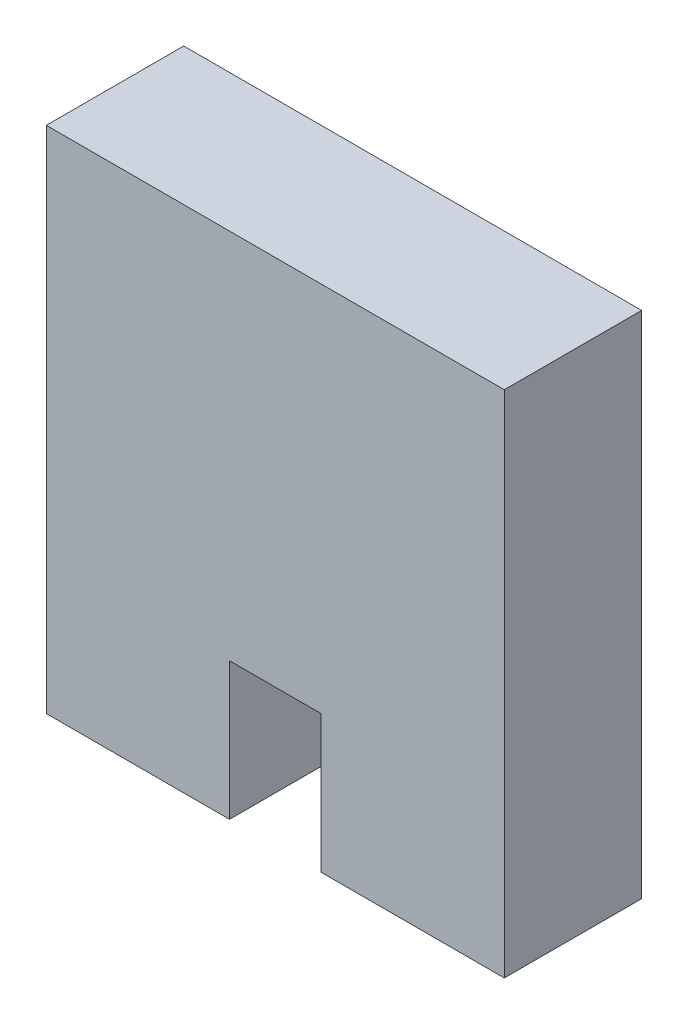
ISO-10303-21;
HEADER;
FILE_DESCRIPTION(('STEP AP214'),'2;1');
FILE_NAME('part.step','',(''),(''),'','','');
FILE_SCHEMA(('AUTOMOTIVE_DESIGN { 1 0 10303 214 1 1 1 1 }'));
ENDSEC;
DATA;
#1=APPLICATION_CONTEXT('core data for automotive mechanical design processes');
#2=APPLICATION_PROTOCOL_DEFINITION('international standard','automotive_design',2000,#1);
#3=PRODUCT_CONTEXT('',#1,'mechanical');
#4=PRODUCT('Part','Part','',(#3));
#5=PRODUCT_RELATED_PRODUCT_CATEGORY('part','',(#4));
#6=PRODUCT_DEFINITION_FORMATION('','',#4);
#7=PRODUCT_DEFINITION_CONTEXT('part definition',#1,'design');
#8=PRODUCT_DEFINITION('design','',#6,#7);
#9=PRODUCT_DEFINITION_SHAPE('','',#8);
#10=(LENGTH_UNIT() NAMED_UNIT(*) SI_UNIT(.MILLI.,.METRE.));
#11=(NAMED_UNIT(*) PLANE_ANGLE_UNIT() SI_UNIT($,.RADIAN.));
#12=(NAMED_UNIT(*) SI_UNIT($,.STERADIAN.) SOLID_ANGLE_UNIT());
#13=UNCERTAINTY_MEASURE_WITH_UNIT(LENGTH_MEASURE(1.E-05),#10,'distance_accuracy_value','');
#14=(GEOMETRIC_REPRESENTATION_CONTEXT(3) GLOBAL_UNCERTAINTY_ASSIGNED_CONTEXT((#13)) GLOBAL_UNIT_ASSIGNED_CONTEXT((#10,
#11,#12)) REPRESENTATION_CONTEXT('',''));
#15=CARTESIAN_POINT('',(0.,0.,0.));
#16=DIRECTION('',(0.,0.,1.));
#17=DIRECTION('',(1.,0.,0.));
#18=AXIS2_PLACEMENT_3D('',#15,#16,#17);
#19=CARTESIAN_POINT('',(-8.,0.,6.));
#20=DIRECTION('',(0.,1.,0.));
#21=DIRECTION('',(0.,0.,1.));
#22=AXIS2_PLACEMENT_3D('',#19,#20,#21);
#23=PLANE('',#22);
#24=DIRECTION('',(1.,0.,0.));
#25=VECTOR('',#24,1.);
#26=CARTESIAN_POINT('',(-8.,0.,0.));
#27=LINE('',#26,#25);
#28=CARTESIAN_POINT('',(-8.,0.,0.));
#29=VERTEX_POINT('',#28);
#30=CARTESIAN_POINT('',(0.,0.,0.));
#31=VERTEX_POINT('',#30);
#32=EDGE_CURVE('E133',#29,#31,#27,.T.);
#33=ORIENTED_EDGE('',*,*,#32,.T.);
#34=DIRECTION('',(0.,0.,-1.));
#35=VECTOR('',#34,1.);
#36=CARTESIAN_POINT('',(0.,0.,6.));
#37=LINE('',#36,#35);
#38=CARTESIAN_POINT('',(0.,0.,6.));
#39=VERTEX_POINT('',#38);
#40=EDGE_CURVE('E11',#39,#31,#37,.T.);
#41=ORIENTED_EDGE('',*,*,#40,.F.);
#42=DIRECTION('',(1.,0.,0.));
#43=VECTOR('',#42,1.);
#44=CARTESIAN_POINT('',(-8.,0.,6.));
#45=LINE('',#44,#43);
#46=CARTESIAN_POINT('',(-8.,0.,6.));
#47=VERTEX_POINT('',#46);
#48=EDGE_CURVE('E147',#47,#39,#45,.T.);
#49=ORIENTED_EDGE('',*,*,#48,.F.);
#50=DIRECTION('',(0.,0.,-1.));
#51=VECTOR('',#50,1.);
#52=CARTESIAN_POINT('',(-8.,0.,6.));
#53=LINE('',#52,#51);
#54=EDGE_CURVE('E129',#47,#29,#53,.T.);
#55=ORIENTED_EDGE('',*,*,#54,.T.);
#56=EDGE_LOOP('',(#33,#41,#49,#55));
#57=FACE_BOUND('',#56,.T.);
#58=ADVANCED_FACE('F37',(#57),#23,.F.);
#59=CARTESIAN_POINT('',(0.,0.,6.));
#60=DIRECTION('',(-1.,0.,0.));
#61=DIRECTION('',(0.,0.,1.));
#62=AXIS2_PLACEMENT_3D('',#59,#60,#61);
#63=PLANE('',#62);
#64=DIRECTION('',(0.,1.,0.));
#65=VECTOR('',#64,1.);
#66=CARTESIAN_POINT('',(0.,0.,0.));
#67=LINE('',#66,#65);
#68=CARTESIAN_POINT('',(0.,22.25,0.));
#69=VERTEX_POINT('',#68);
#70=EDGE_CURVE('E136',#31,#69,#67,.T.);
#71=ORIENTED_EDGE('',*,*,#70,.T.);
#72=DIRECTION('',(0.,0.,-1.));
#73=VECTOR('',#72,1.);
#74=CARTESIAN_POINT('',(0.,22.25,6.));
#75=LINE('',#74,#73);
#76=CARTESIAN_POINT('',(0.,22.25,6.));
#77=VERTEX_POINT('',#76);
#78=EDGE_CURVE('E45',#77,#69,#75,.T.);
#79=ORIENTED_EDGE('',*,*,#78,.F.);
#80=DIRECTION('',(0.,1.,0.));
#81=VECTOR('',#80,1.);
#82=CARTESIAN_POINT('',(0.,0.,6.));
#83=LINE('',#82,#81);
#84=EDGE_CURVE('E96',#39,#77,#83,.T.);
#85=ORIENTED_EDGE('',*,*,#84,.F.);
#86=ORIENTED_EDGE('',*,*,#40,.T.);
#87=EDGE_LOOP('',(#71,#79,#85,#86));
#88=FACE_BOUND('',#87,.T.);
#89=ADVANCED_FACE('F182',(#88),#63,.F.);
#90=CARTESIAN_POINT('',(0.,22.25,6.));
#91=DIRECTION('',(0.,-1.,0.));
#92=DIRECTION('',(0.,0.,-1.));
#93=AXIS2_PLACEMENT_3D('',#90,#91,#92);
#94=PLANE('',#93);
#95=DIRECTION('',(-1.,0.,0.));
#96=VECTOR('',#95,1.);
#97=CARTESIAN_POINT('',(0.,22.25,0.));
#98=LINE('',#97,#96);
#99=CARTESIAN_POINT('',(-20.,22.25,0.));
#100=VERTEX_POINT('',#99);
#101=EDGE_CURVE('E138',#69,#100,#98,.T.);
#102=ORIENTED_EDGE('',*,*,#101,.T.);
#103=DIRECTION('',(0.,0.,-1.));
#104=VECTOR('',#103,1.);
#105=CARTESIAN_POINT('',(-20.,22.25,6.));
#106=LINE('',#105,#104);
#107=CARTESIAN_POINT('',(-20.,22.25,6.));
#108=VERTEX_POINT('',#107);
#109=EDGE_CURVE('E154',#108,#100,#106,.T.);
#110=ORIENTED_EDGE('',*,*,#109,.F.);
#111=DIRECTION('',(-1.,0.,0.));
#112=VECTOR('',#111,1.);
#113=CARTESIAN_POINT('',(0.,22.25,6.));
#114=LINE('',#113,#112);
#115=EDGE_CURVE('E162',#77,#108,#114,.T.);
#116=ORIENTED_EDGE('',*,*,#115,.F.);
#117=ORIENTED_EDGE('',*,*,#78,.T.);
#118=EDGE_LOOP('',(#102,#110,#116,#117));
#119=FACE_BOUND('',#118,.T.);
#120=ADVANCED_FACE('F160',(#119),#94,.F.);
#121=CARTESIAN_POINT('',(-20.,22.25,6.));
#122=DIRECTION('',(1.,0.,0.));
#123=DIRECTION('',(0.,0.,-1.));
#124=AXIS2_PLACEMENT_3D('',#121,#122,#123);
#125=PLANE('',#124);
#126=DIRECTION('',(0.,-1.,0.));
#127=VECTOR('',#126,1.);
#128=CARTESIAN_POINT('',(-20.,22.25,0.));
#129=LINE('',#128,#127);
#130=CARTESIAN_POINT('',(-20.,0.,0.));
#131=VERTEX_POINT('',#130);
#132=EDGE_CURVE('E140',#100,#131,#129,.T.);
#133=ORIENTED_EDGE('',*,*,#132,.T.);
#134=DIRECTION('',(0.,0.,-1.));
#135=VECTOR('',#134,1.);
#136=CARTESIAN_POINT('',(-20.,0.,6.));
#137=LINE('',#136,#135);
#138=CARTESIAN_POINT('',(-20.,0.,6.));
#139=VERTEX_POINT('',#138);
#140=EDGE_CURVE('E151',#139,#131,#137,.T.);
#141=ORIENTED_EDGE('',*,*,#140,.F.);
#142=DIRECTION('',(0.,-1.,0.));
#143=VECTOR('',#142,1.);
#144=CARTESIAN_POINT('',(-20.,22.25,6.));
#145=LINE('',#144,#143);
#146=EDGE_CURVE('E174',#108,#139,#145,.T.);
#147=ORIENTED_EDGE('',*,*,#146,.F.);
#148=ORIENTED_EDGE('',*,*,#109,.T.);
#149=EDGE_LOOP('',(#133,#141,#147,#148));
#150=FACE_BOUND('',#149,.T.);
#151=ADVANCED_FACE('F170',(#150),#125,.F.);
#152=CARTESIAN_POINT('',(-20.,0.,6.));
#153=DIRECTION('',(0.,1.,0.));
#154=DIRECTION('',(0.,0.,1.));
#155=AXIS2_PLACEMENT_3D('',#152,#153,#154);
#156=PLANE('',#155);
#157=DIRECTION('',(1.,0.,0.));
#158=VECTOR('',#157,1.);
#159=CARTESIAN_POINT('',(-20.,0.,0.));
#160=LINE('',#159,#158);
#161=CARTESIAN_POINT('',(-12.,0.,0.));
#162=VERTEX_POINT('',#161);
#163=EDGE_CURVE('E142',#131,#162,#160,.T.);
#164=ORIENTED_EDGE('',*,*,#163,.T.);
#165=DIRECTION('',(0.,0.,-1.));
#166=VECTOR('',#165,1.);
#167=CARTESIAN_POINT('',(-12.,0.,6.));
#168=LINE('',#167,#166);
#169=CARTESIAN_POINT('',(-12.,0.,6.));
#170=VERTEX_POINT('',#169);
#171=EDGE_CURVE('E124',#170,#162,#168,.T.);
#172=ORIENTED_EDGE('',*,*,#171,.F.);
#173=DIRECTION('',(1.,0.,0.));
#174=VECTOR('',#173,1.);
#175=CARTESIAN_POINT('',(-20.,0.,6.));
#176=LINE('',#175,#174);
#177=EDGE_CURVE('E115',#139,#170,#176,.T.);
#178=ORIENTED_EDGE('',*,*,#177,.F.);
#179=ORIENTED_EDGE('',*,*,#140,.T.);
#180=EDGE_LOOP('',(#164,#172,#178,#179));
#181=FACE_BOUND('',#180,.T.);
#182=ADVANCED_FACE('F173',(#181),#156,.F.);
#183=CARTESIAN_POINT('',(-12.,0.,6.));
#184=DIRECTION('',(-1.,0.,0.));
#185=DIRECTION('',(0.,0.,1.));
#186=AXIS2_PLACEMENT_3D('',#183,#184,#185);
#187=PLANE('',#186);
#188=DIRECTION('',(0.,1.,0.));
#189=VECTOR('',#188,1.);
#190=CARTESIAN_POINT('',(-12.,0.,0.));
#191=LINE('',#190,#189);
#192=CARTESIAN_POINT('',(-12.,6.,0.));
#193=VERTEX_POINT('',#192);
#194=EDGE_CURVE('E123',#162,#193,#191,.T.);
#195=ORIENTED_EDGE('',*,*,#194,.T.);
#196=DIRECTION('',(0.,0.,-1.));
#197=VECTOR('',#196,1.);
#198=CARTESIAN_POINT('',(-12.,6.,6.));
#199=LINE('',#198,#197);
#200=CARTESIAN_POINT('',(-12.,6.,6.));
#201=VERTEX_POINT('',#200);
#202=EDGE_CURVE('E120',#201,#193,#199,.T.);
#203=ORIENTED_EDGE('',*,*,#202,.F.);
#204=DIRECTION('',(0.,1.,0.));
#205=VECTOR('',#204,1.);
#206=CARTESIAN_POINT('',(-12.,0.,6.));
#207=LINE('',#206,#205);
#208=EDGE_CURVE('E109',#170,#201,#207,.T.);
#209=ORIENTED_EDGE('',*,*,#208,.F.);
#210=ORIENTED_EDGE('',*,*,#171,.T.);
#211=EDGE_LOOP('',(#195,#203,#209,#210));
#212=FACE_BOUND('',#211,.T.);
#213=ADVANCED_FACE('F121',(#212),#187,.F.);
#214=CARTESIAN_POINT('',(-12.,6.,6.));
#215=DIRECTION('',(0.,1.,0.));
#216=DIRECTION('',(0.,0.,1.));
#217=AXIS2_PLACEMENT_3D('',#214,#215,#216);
#218=PLANE('',#217);
#219=DIRECTION('',(1.,0.,0.));
#220=VECTOR('',#219,1.);
#221=CARTESIAN_POINT('',(-12.,6.,0.));
#222=LINE('',#221,#220);
#223=CARTESIAN_POINT('',(-8.,6.,0.));
#224=VERTEX_POINT('',#223);
#225=EDGE_CURVE('E82',#193,#224,#222,.T.);
#226=ORIENTED_EDGE('',*,*,#225,.T.);
#227=DIRECTION('',(0.,0.,-1.));
#228=VECTOR('',#227,1.);
#229=CARTESIAN_POINT('',(-8.,6.,6.));
#230=LINE('',#229,#228);
#231=CARTESIAN_POINT('',(-8.,6.,6.));
#232=VERTEX_POINT('',#231);
#233=EDGE_CURVE('E125',#232,#224,#230,.T.);
#234=ORIENTED_EDGE('',*,*,#233,.F.);
#235=DIRECTION('',(1.,0.,0.));
#236=VECTOR('',#235,1.);
#237=CARTESIAN_POINT('',(-12.,6.,6.));
#238=LINE('',#237,#236);
#239=EDGE_CURVE('E113',#201,#232,#238,.T.);
#240=ORIENTED_EDGE('',*,*,#239,.F.);
#241=ORIENTED_EDGE('',*,*,#202,.T.);
#242=EDGE_LOOP('',(#226,#234,#240,#241));
#243=FACE_BOUND('',#242,.T.);
#244=ADVANCED_FACE('F127',(#243),#218,.F.);
#245=CARTESIAN_POINT('',(-8.,6.,6.));
#246=DIRECTION('',(1.,0.,0.));
#247=DIRECTION('',(0.,0.,-1.));
#248=AXIS2_PLACEMENT_3D('',#245,#246,#247);
#249=PLANE('',#248);
#250=DIRECTION('',(0.,-1.,0.));
#251=VECTOR('',#250,1.);
#252=CARTESIAN_POINT('',(-8.,6.,0.));
#253=LINE('',#252,#251);
#254=EDGE_CURVE('E88',#224,#29,#253,.T.);
#255=ORIENTED_EDGE('',*,*,#254,.T.);
#256=ORIENTED_EDGE('',*,*,#54,.F.);
#257=DIRECTION('',(0.,-1.,0.));
#258=VECTOR('',#257,1.);
#259=CARTESIAN_POINT('',(-8.,6.,6.));
#260=LINE('',#259,#258);
#261=EDGE_CURVE('E53',#232,#47,#260,.T.);
#262=ORIENTED_EDGE('',*,*,#261,.F.);
#263=ORIENTED_EDGE('',*,*,#233,.T.);
#264=EDGE_LOOP('',(#255,#256,#262,#263));
#265=FACE_BOUND('',#264,.T.);
#266=ADVANCED_FACE('F198',(#265),#249,.F.);
#267=CARTESIAN_POINT('',(0.,0.,6.));
#268=DIRECTION('',(0.,0.,1.));
#269=DIRECTION('',(1.,0.,0.));
#270=AXIS2_PLACEMENT_3D('',#267,#268,#269);
#271=PLANE('',#270);
#272=ORIENTED_EDGE('',*,*,#48,.T.);
#273=ORIENTED_EDGE('',*,*,#84,.T.);
#274=ORIENTED_EDGE('',*,*,#115,.T.);
#275=ORIENTED_EDGE('',*,*,#146,.T.);
#276=ORIENTED_EDGE('',*,*,#177,.T.);
#277=ORIENTED_EDGE('',*,*,#208,.T.);
#278=ORIENTED_EDGE('',*,*,#239,.T.);
#279=ORIENTED_EDGE('',*,*,#261,.T.);
#280=EDGE_LOOP('',(#272,#273,#274,#275,#276,#277,#278,#279));
#281=FACE_BOUND('',#280,.T.);
#282=ADVANCED_FACE('F111',(#281),#271,.T.);
#283=CARTESIAN_POINT('',(0.,0.,0.));
#284=DIRECTION('',(0.,0.,1.));
#285=DIRECTION('',(1.,0.,0.));
#286=AXIS2_PLACEMENT_3D('',#283,#284,#285);
#287=PLANE('',#286);
#288=ORIENTED_EDGE('',*,*,#32,.F.);
#289=ORIENTED_EDGE('',*,*,#254,.F.);
#290=ORIENTED_EDGE('',*,*,#225,.F.);
#291=ORIENTED_EDGE('',*,*,#194,.F.);
#292=ORIENTED_EDGE('',*,*,#163,.F.);
#293=ORIENTED_EDGE('',*,*,#132,.F.);
#294=ORIENTED_EDGE('',*,*,#101,.F.);
#295=ORIENTED_EDGE('',*,*,#70,.F.);
#296=EDGE_LOOP('',(#288,#289,#290,#291,#292,#293,#294,#295));
#297=FACE_BOUND('',#296,.T.);
#298=ADVANCED_FACE('F166',(#297),#287,.F.);
#299=CLOSED_SHELL('',(#58,#89,#120,#151,#182,#213,#244,#266,#282,#298));
#300=MANIFOLD_SOLID_BREP('B2',#299);
#301=ADVANCED_BREP_SHAPE_REPRESENTATION('',(#18,#300),#14);
#302=SHAPE_DEFINITION_REPRESENTATION(#9,#301);
ENDSEC;
END-ISO-10303-21;
